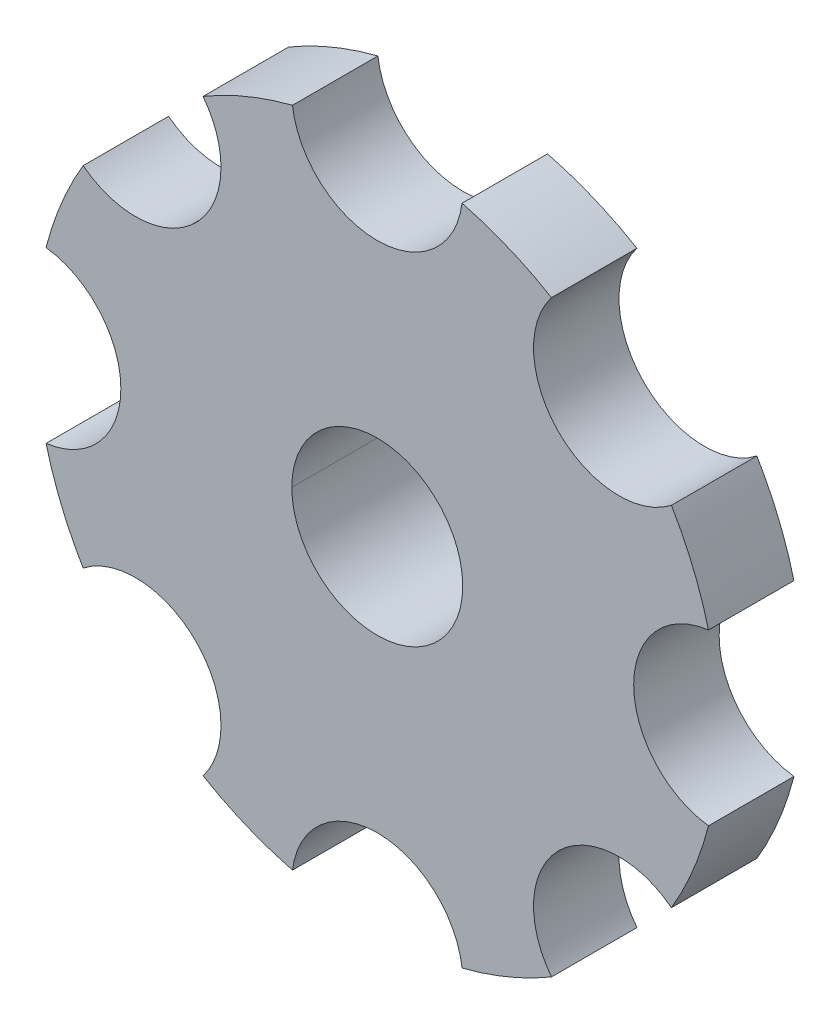
ISO-10303-21;
HEADER;
FILE_DESCRIPTION(('STEP AP214'),'2;1');
FILE_NAME('part.step','',(''),(''),'','','');
FILE_SCHEMA(('AUTOMOTIVE_DESIGN { 1 0 10303 214 1 1 1 1 }'));
ENDSEC;
DATA;
#1=APPLICATION_CONTEXT('core data for automotive mechanical design processes');
#2=APPLICATION_PROTOCOL_DEFINITION('international standard','automotive_design',2000,#1);
#3=PRODUCT_CONTEXT('',#1,'mechanical');
#4=PRODUCT('Part','Part','',(#3));
#5=PRODUCT_RELATED_PRODUCT_CATEGORY('part','',(#4));
#6=PRODUCT_DEFINITION_FORMATION('','',#4);
#7=PRODUCT_DEFINITION_CONTEXT('part definition',#1,'design');
#8=PRODUCT_DEFINITION('design','',#6,#7);
#9=PRODUCT_DEFINITION_SHAPE('','',#8);
#10=(LENGTH_UNIT() NAMED_UNIT(*) SI_UNIT(.MILLI.,.METRE.));
#11=(NAMED_UNIT(*) PLANE_ANGLE_UNIT() SI_UNIT($,.RADIAN.));
#12=(NAMED_UNIT(*) SI_UNIT($,.STERADIAN.) SOLID_ANGLE_UNIT());
#13=UNCERTAINTY_MEASURE_WITH_UNIT(LENGTH_MEASURE(1.E-05),#10,'distance_accuracy_value','');
#14=(GEOMETRIC_REPRESENTATION_CONTEXT(3) GLOBAL_UNCERTAINTY_ASSIGNED_CONTEXT((#13)) GLOBAL_UNIT_ASSIGNED_CONTEXT((#10,
#11,#12)) REPRESENTATION_CONTEXT('',''));
#15=CARTESIAN_POINT('',(0.,0.,0.));
#16=DIRECTION('',(0.,0.,1.));
#17=DIRECTION('',(1.,0.,0.));
#18=AXIS2_PLACEMENT_3D('',#15,#16,#17);
#19=CARTESIAN_POINT('',(0.,0.,0.4));
#20=DIRECTION('',(0.,0.,1.));
#21=DIRECTION('',(1.,0.,0.));
#22=AXIS2_PLACEMENT_3D('',#19,#20,#21);
#23=TOROIDAL_SURFACE('',#22,0.85,0.1);
#24=CARTESIAN_POINT('',(-0.85,0.,0.4));
#25=DIRECTION('',(0.,1.,0.));
#26=DIRECTION('',(-1.,0.,0.));
#27=AXIS2_PLACEMENT_3D('',#24,#25,#26);
#28=CIRCLE('',#27,0.1);
#29=CARTESIAN_POINT('',(-0.85,0.,0.5));
#30=VERTEX_POINT('',#29);
#31=CARTESIAN_POINT('',(-0.75,0.,0.4));
#32=VERTEX_POINT('',#31);
#33=EDGE_CURVE('E346',#30,#32,#28,.T.);
#34=ORIENTED_EDGE('',*,*,#33,.F.);
#35=CARTESIAN_POINT('',(0.,0.,0.5));
#36=DIRECTION('',(0.,0.,1.));
#37=DIRECTION('',(1.,0.,0.));
#38=AXIS2_PLACEMENT_3D('',#35,#36,#37);
#39=CIRCLE('',#38,0.85);
#40=CARTESIAN_POINT('',(0.85,0.,0.5));
#41=VERTEX_POINT('',#40);
#42=EDGE_CURVE('E10',#41,#30,#39,.T.);
#43=ORIENTED_EDGE('',*,*,#42,.F.);
#44=CARTESIAN_POINT('',(0.85,0.,0.4));
#45=DIRECTION('',(0.,-1.,0.));
#46=DIRECTION('',(0.,0.,-1.));
#47=AXIS2_PLACEMENT_3D('',#44,#45,#46);
#48=CIRCLE('',#47,0.1);
#49=CARTESIAN_POINT('',(0.75,0.,0.4));
#50=VERTEX_POINT('',#49);
#51=EDGE_CURVE('E522',#41,#50,#48,.T.);
#52=ORIENTED_EDGE('',*,*,#51,.T.);
#53=CARTESIAN_POINT('',(0.,0.,0.4));
#54=DIRECTION('',(0.,0.,-1.));
#55=DIRECTION('',(1.,0.,0.));
#56=AXIS2_PLACEMENT_3D('',#53,#54,#55);
#57=CIRCLE('',#56,0.75);
#58=EDGE_CURVE('E373',#32,#50,#57,.T.);
#59=ORIENTED_EDGE('',*,*,#58,.F.);
#60=EDGE_LOOP('',(#34,#43,#52,#59));
#61=FACE_BOUND('',#60,.T.);
#62=ADVANCED_FACE('F16',(#61),#23,.F.);
#63=CARTESIAN_POINT('',(-2.,0.,0.));
#64=DIRECTION('',(0.,0.,1.));
#65=DIRECTION('',(1.,0.,0.));
#66=AXIS2_PLACEMENT_3D('',#63,#64,#65);
#67=CYLINDRICAL_SURFACE('',#66,0.5);
#68=DIRECTION('',(0.,0.,1.));
#69=VECTOR('',#68,1.);
#70=CARTESIAN_POINT('',(-1.5,0.,0.));
#71=LINE('',#70,#69);
#72=CARTESIAN_POINT('',(-1.5,0.,0.5));
#73=VERTEX_POINT('',#72);
#74=CARTESIAN_POINT('',(-1.5,0.,1.));
#75=VERTEX_POINT('',#74);
#76=EDGE_CURVE('E525',#73,#75,#71,.T.);
#77=ORIENTED_EDGE('',*,*,#76,.F.);
#78=CARTESIAN_POINT('',(-2.,0.,0.5));
#79=DIRECTION('',(0.,0.,1.));
#80=DIRECTION('',(1.,0.,0.));
#81=AXIS2_PLACEMENT_3D('',#78,#79,#80);
#82=CIRCLE('',#81,0.5);
#83=CARTESIAN_POINT('',(-1.9375,-0.496078370824618,0.5));
#84=VERTEX_POINT('',#83);
#85=EDGE_CURVE('E309',#84,#73,#82,.T.);
#86=ORIENTED_EDGE('',*,*,#85,.F.);
#87=DIRECTION('',(0.,0.,-1.));
#88=VECTOR('',#87,1.);
#89=CARTESIAN_POINT('',(-1.9375,-0.496078370824618,0.5));
#90=LINE('',#89,#88);
#91=CARTESIAN_POINT('',(-1.9375,-0.496078370824618,1.));
#92=VERTEX_POINT('',#91);
#93=EDGE_CURVE('E408',#92,#84,#90,.T.);
#94=ORIENTED_EDGE('',*,*,#93,.F.);
#95=CARTESIAN_POINT('',(-2.,0.,1.));
#96=DIRECTION('',(0.,0.,1.));
#97=DIRECTION('',(0.,1.,0.));
#98=AXIS2_PLACEMENT_3D('',#95,#96,#97);
#99=CIRCLE('',#98,0.5);
#100=EDGE_CURVE('E323',#92,#75,#99,.T.);
#101=ORIENTED_EDGE('',*,*,#100,.T.);
#102=EDGE_LOOP('',(#77,#86,#94,#101));
#103=FACE_BOUND('',#102,.T.);
#104=ADVANCED_FACE('F922',(#103),#67,.F.);
#105=CARTESIAN_POINT('',(-1.41421356237309,-1.4142135623731,0.));
#106=DIRECTION('',(0.,0.,1.));
#107=DIRECTION('',(1.,0.,0.));
#108=AXIS2_PLACEMENT_3D('',#105,#106,#107);
#109=CYLINDRICAL_SURFACE('',#108,0.5);
#110=DIRECTION('',(0.,0.,1.));
#111=VECTOR('',#110,1.);
#112=CARTESIAN_POINT('',(-0.914213562373088,-1.4142135623731,0.));
#113=LINE('',#112,#111);
#114=CARTESIAN_POINT('',(-0.914213562373088,-1.4142135623731,0.5));
#115=VERTEX_POINT('',#114);
#116=CARTESIAN_POINT('',(-0.914213562373088,-1.4142135623731,1.));
#117=VERTEX_POINT('',#116);
#118=EDGE_CURVE('E532',#115,#117,#113,.T.);
#119=ORIENTED_EDGE('',*,*,#118,.F.);
#120=CARTESIAN_POINT('',(-1.41421356237309,-1.4142135623731,0.5));
#121=DIRECTION('',(0.,0.,1.));
#122=DIRECTION('',(1.,0.,0.));
#123=AXIS2_PLACEMENT_3D('',#120,#121,#122);
#124=CIRCLE('',#123,0.5);
#125=CARTESIAN_POINT('',(-1.01923900853887,-1.720799768559,0.5));
#126=VERTEX_POINT('',#125);
#127=EDGE_CURVE('E27',#126,#115,#124,.T.);
#128=ORIENTED_EDGE('',*,*,#127,.F.);
#129=DIRECTION('',(0.,0.,-1.));
#130=VECTOR('',#129,1.);
#131=CARTESIAN_POINT('',(-1.01923900853887,-1.720799768559,0.5));
#132=LINE('',#131,#130);
#133=CARTESIAN_POINT('',(-1.01923900853887,-1.720799768559,1.));
#134=VERTEX_POINT('',#133);
#135=EDGE_CURVE('E334',#134,#126,#132,.T.);
#136=ORIENTED_EDGE('',*,*,#135,.F.);
#137=CARTESIAN_POINT('',(-1.41421356237309,-1.4142135623731,1.));
#138=DIRECTION('',(0.,0.,1.));
#139=DIRECTION('',(-0.707106781186551,0.707106781186544,0.));
#140=AXIS2_PLACEMENT_3D('',#137,#138,#139);
#141=CIRCLE('',#140,0.5);
#142=EDGE_CURVE('E209',#134,#117,#141,.T.);
#143=ORIENTED_EDGE('',*,*,#142,.T.);
#144=EDGE_LOOP('',(#119,#128,#136,#143));
#145=FACE_BOUND('',#144,.T.);
#146=ADVANCED_FACE('F926',(#145),#109,.F.);
#147=CARTESIAN_POINT('',(0.,-2.,0.));
#148=DIRECTION('',(0.,0.,1.));
#149=DIRECTION('',(1.,0.,0.));
#150=AXIS2_PLACEMENT_3D('',#147,#148,#149);
#151=CYLINDRICAL_SURFACE('',#150,0.5);
#152=CARTESIAN_POINT('',(0.,-2.,0.5));
#153=DIRECTION('',(0.,0.,1.));
#154=DIRECTION('',(1.,0.,0.));
#155=AXIS2_PLACEMENT_3D('',#152,#153,#154);
#156=CIRCLE('',#155,0.5);
#157=CARTESIAN_POINT('',(0.496078370824611,-1.9375,0.5));
#158=VERTEX_POINT('',#157);
#159=CARTESIAN_POINT('',(-0.496078370824611,-1.9375,0.5));
#160=VERTEX_POINT('',#159);
#161=EDGE_CURVE('E405',#158,#160,#156,.T.);
#162=ORIENTED_EDGE('',*,*,#161,.F.);
#163=DIRECTION('',(0.,0.,-1.));
#164=VECTOR('',#163,1.);
#165=CARTESIAN_POINT('',(0.496078370824611,-1.9375,0.5));
#166=LINE('',#165,#164);
#167=CARTESIAN_POINT('',(0.496078370824611,-1.9375,1.));
#168=VERTEX_POINT('',#167);
#169=EDGE_CURVE('E20',#168,#158,#166,.T.);
#170=ORIENTED_EDGE('',*,*,#169,.F.);
#171=CARTESIAN_POINT('',(0.,-2.,1.));
#172=DIRECTION('',(0.,0.,1.));
#173=DIRECTION('',(-1.,0.,0.));
#174=AXIS2_PLACEMENT_3D('',#171,#172,#173);
#175=CIRCLE('',#174,0.5);
#176=CARTESIAN_POINT('',(-0.496078370824611,-1.9375,1.));
#177=VERTEX_POINT('',#176);
#178=EDGE_CURVE('E322',#168,#177,#175,.T.);
#179=ORIENTED_EDGE('',*,*,#178,.T.);
#180=DIRECTION('',(0.,0.,1.));
#181=VECTOR('',#180,1.);
#182=CARTESIAN_POINT('',(-0.496078370824611,-1.9375,0.5));
#183=LINE('',#182,#181);
#184=EDGE_CURVE('E436',#160,#177,#183,.T.);
#185=ORIENTED_EDGE('',*,*,#184,.F.);
#186=EDGE_LOOP('',(#162,#170,#179,#185));
#187=FACE_BOUND('',#186,.T.);
#188=ADVANCED_FACE('F969',(#187),#151,.F.);
#189=CARTESIAN_POINT('',(1.41421356237311,-1.41421356237308,0.));
#190=DIRECTION('',(0.,0.,1.));
#191=DIRECTION('',(1.,0.,0.));
#192=AXIS2_PLACEMENT_3D('',#189,#190,#191);
#193=CYLINDRICAL_SURFACE('',#192,0.5);
#194=CARTESIAN_POINT('',(1.41421356237311,-1.41421356237308,0.5));
#195=DIRECTION('',(0.,0.,1.));
#196=DIRECTION('',(1.,0.,0.));
#197=AXIS2_PLACEMENT_3D('',#194,#195,#196);
#198=CIRCLE('',#197,0.5);
#199=CARTESIAN_POINT('',(1.720799768559,-1.01923900853886,0.5));
#200=VERTEX_POINT('',#199);
#201=CARTESIAN_POINT('',(1.01923900853889,-1.72079976855898,0.5));
#202=VERTEX_POINT('',#201);
#203=EDGE_CURVE('E254',#200,#202,#198,.T.);
#204=ORIENTED_EDGE('',*,*,#203,.F.);
#205=DIRECTION('',(0.,0.,-1.));
#206=VECTOR('',#205,1.);
#207=CARTESIAN_POINT('',(1.720799768559,-1.01923900853886,0.5));
#208=LINE('',#207,#206);
#209=CARTESIAN_POINT('',(1.720799768559,-1.01923900853886,1.));
#210=VERTEX_POINT('',#209);
#211=EDGE_CURVE('E269',#210,#200,#208,.T.);
#212=ORIENTED_EDGE('',*,*,#211,.F.);
#213=CARTESIAN_POINT('',(1.41421356237311,-1.41421356237308,1.));
#214=DIRECTION('',(0.,0.,1.));
#215=DIRECTION('',(-0.707106781186542,-0.707106781186554,0.));
#216=AXIS2_PLACEMENT_3D('',#213,#214,#215);
#217=CIRCLE('',#216,0.5);
#218=CARTESIAN_POINT('',(1.01923900853889,-1.72079976855898,1.));
#219=VERTEX_POINT('',#218);
#220=EDGE_CURVE('E400',#210,#219,#217,.T.);
#221=ORIENTED_EDGE('',*,*,#220,.T.);
#222=DIRECTION('',(0.,0.,1.));
#223=VECTOR('',#222,1.);
#224=CARTESIAN_POINT('',(1.01923900853889,-1.72079976855898,0.5));
#225=LINE('',#224,#223);
#226=EDGE_CURVE('E310',#202,#219,#225,.T.);
#227=ORIENTED_EDGE('',*,*,#226,.F.);
#228=EDGE_LOOP('',(#204,#212,#221,#227));
#229=FACE_BOUND('',#228,.T.);
#230=ADVANCED_FACE('F467',(#229),#193,.F.);
#231=CARTESIAN_POINT('',(2.,0.,0.));
#232=DIRECTION('',(0.,0.,1.));
#233=DIRECTION('',(1.,0.,0.));
#234=AXIS2_PLACEMENT_3D('',#231,#232,#233);
#235=CYLINDRICAL_SURFACE('',#234,0.5);
#236=CARTESIAN_POINT('',(2.,0.,0.5));
#237=DIRECTION('',(0.,0.,1.));
#238=DIRECTION('',(1.,0.,0.));
#239=AXIS2_PLACEMENT_3D('',#236,#237,#238);
#240=CIRCLE('',#239,0.5);
#241=CARTESIAN_POINT('',(1.9375,0.496078370824631,0.5));
#242=VERTEX_POINT('',#241);
#243=CARTESIAN_POINT('',(1.9375,-0.496078370824591,0.5));
#244=VERTEX_POINT('',#243);
#245=EDGE_CURVE('E242',#242,#244,#240,.T.);
#246=ORIENTED_EDGE('',*,*,#245,.F.);
#247=DIRECTION('',(0.,0.,-1.));
#248=VECTOR('',#247,1.);
#249=CARTESIAN_POINT('',(1.9375,0.496078370824631,0.5));
#250=LINE('',#249,#248);
#251=CARTESIAN_POINT('',(1.9375,0.496078370824631,1.));
#252=VERTEX_POINT('',#251);
#253=EDGE_CURVE('E294',#252,#242,#250,.T.);
#254=ORIENTED_EDGE('',*,*,#253,.F.);
#255=CARTESIAN_POINT('',(2.,0.,1.));
#256=DIRECTION('',(0.,0.,1.));
#257=DIRECTION('',(0.,-1.,0.));
#258=AXIS2_PLACEMENT_3D('',#255,#256,#257);
#259=CIRCLE('',#258,0.5);
#260=CARTESIAN_POINT('',(1.9375,-0.496078370824591,1.));
#261=VERTEX_POINT('',#260);
#262=EDGE_CURVE('E260',#252,#261,#259,.T.);
#263=ORIENTED_EDGE('',*,*,#262,.T.);
#264=DIRECTION('',(0.,0.,1.));
#265=VECTOR('',#264,1.);
#266=CARTESIAN_POINT('',(1.9375,-0.496078370824591,0.5));
#267=LINE('',#266,#265);
#268=EDGE_CURVE('E258',#244,#261,#267,.T.);
#269=ORIENTED_EDGE('',*,*,#268,.F.);
#270=EDGE_LOOP('',(#246,#254,#263,#269));
#271=FACE_BOUND('',#270,.T.);
#272=ADVANCED_FACE('F259',(#271),#235,.F.);
#273=CARTESIAN_POINT('',(1.41421356237308,1.41421356237311,0.));
#274=DIRECTION('',(0.,0.,1.));
#275=DIRECTION('',(1.,0.,0.));
#276=AXIS2_PLACEMENT_3D('',#273,#274,#275);
#277=CYLINDRICAL_SURFACE('',#276,0.5);
#278=CARTESIAN_POINT('',(1.41421356237308,1.41421356237311,0.5));
#279=DIRECTION('',(0.,0.,1.));
#280=DIRECTION('',(1.,0.,0.));
#281=AXIS2_PLACEMENT_3D('',#278,#279,#280);
#282=CIRCLE('',#281,0.5);
#283=CARTESIAN_POINT('',(1.01923900853886,1.72079976855901,0.5));
#284=VERTEX_POINT('',#283);
#285=CARTESIAN_POINT('',(1.72079976855898,1.0192390085389,0.5));
#286=VERTEX_POINT('',#285);
#287=EDGE_CURVE('E255',#284,#286,#282,.T.);
#288=ORIENTED_EDGE('',*,*,#287,.F.);
#289=DIRECTION('',(0.,0.,-1.));
#290=VECTOR('',#289,1.);
#291=CARTESIAN_POINT('',(1.01923900853886,1.72079976855901,0.5));
#292=LINE('',#291,#290);
#293=CARTESIAN_POINT('',(1.01923900853886,1.72079976855901,1.));
#294=VERTEX_POINT('',#293);
#295=EDGE_CURVE('E286',#294,#284,#292,.T.);
#296=ORIENTED_EDGE('',*,*,#295,.F.);
#297=CARTESIAN_POINT('',(1.41421356237308,1.41421356237311,1.));
#298=DIRECTION('',(0.,0.,1.));
#299=DIRECTION('',(0.707106781186556,-0.707106781186539,0.));
#300=AXIS2_PLACEMENT_3D('',#297,#298,#299);
#301=CIRCLE('',#300,0.5);
#302=CARTESIAN_POINT('',(1.72079976855898,1.0192390085389,1.));
#303=VERTEX_POINT('',#302);
#304=EDGE_CURVE('E337',#294,#303,#301,.T.);
#305=ORIENTED_EDGE('',*,*,#304,.T.);
#306=DIRECTION('',(0.,0.,1.));
#307=VECTOR('',#306,1.);
#308=CARTESIAN_POINT('',(1.72079976855898,1.0192390085389,0.5));
#309=LINE('',#308,#307);
#310=EDGE_CURVE('E293',#286,#303,#309,.T.);
#311=ORIENTED_EDGE('',*,*,#310,.F.);
#312=EDGE_LOOP('',(#288,#296,#305,#311));
#313=FACE_BOUND('',#312,.T.);
#314=ADVANCED_FACE('F868',(#313),#277,.F.);
#315=CARTESIAN_POINT('',(-1.4142135623731,1.41421356237309,0.));
#316=DIRECTION('',(0.,0.,1.));
#317=DIRECTION('',(1.,0.,0.));
#318=AXIS2_PLACEMENT_3D('',#315,#316,#317);
#319=CYLINDRICAL_SURFACE('',#318,0.5);
#320=DIRECTION('',(0.,0.,1.));
#321=VECTOR('',#320,1.);
#322=CARTESIAN_POINT('',(-0.914213562373098,1.41421356237309,0.));
#323=LINE('',#322,#321);
#324=CARTESIAN_POINT('',(-0.914213562373098,1.41421356237309,0.5));
#325=VERTEX_POINT('',#324);
#326=CARTESIAN_POINT('',(-0.914213562373098,1.41421356237309,1.));
#327=VERTEX_POINT('',#326);
#328=EDGE_CURVE('E295',#325,#327,#323,.T.);
#329=ORIENTED_EDGE('',*,*,#328,.F.);
#330=CARTESIAN_POINT('',(-1.4142135623731,1.41421356237309,0.5));
#331=DIRECTION('',(0.,0.,1.));
#332=DIRECTION('',(1.,0.,0.));
#333=AXIS2_PLACEMENT_3D('',#330,#331,#332);
#334=CIRCLE('',#333,0.5);
#335=CARTESIAN_POINT('',(-1.72079976855899,1.01923900853888,0.5));
#336=VERTEX_POINT('',#335);
#337=EDGE_CURVE('E290',#336,#325,#334,.T.);
#338=ORIENTED_EDGE('',*,*,#337,.F.);
#339=DIRECTION('',(0.,0.,-1.));
#340=VECTOR('',#339,1.);
#341=CARTESIAN_POINT('',(-1.72079976855899,1.01923900853888,0.5));
#342=LINE('',#341,#340);
#343=CARTESIAN_POINT('',(-1.72079976855899,1.01923900853888,1.));
#344=VERTEX_POINT('',#343);
#345=EDGE_CURVE('E367',#344,#336,#342,.T.);
#346=ORIENTED_EDGE('',*,*,#345,.F.);
#347=CARTESIAN_POINT('',(-1.4142135623731,1.41421356237309,1.));
#348=DIRECTION('',(0.,0.,1.));
#349=DIRECTION('',(0.707106781186546,0.707106781186549,0.));
#350=AXIS2_PLACEMENT_3D('',#347,#348,#349);
#351=CIRCLE('',#350,0.5);
#352=EDGE_CURVE('E324',#344,#327,#351,.T.);
#353=ORIENTED_EDGE('',*,*,#352,.T.);
#354=EDGE_LOOP('',(#329,#338,#346,#353));
#355=FACE_BOUND('',#354,.T.);
#356=ADVANCED_FACE('F888',(#355),#319,.F.);
#357=CARTESIAN_POINT('',(0.,2.,0.));
#358=DIRECTION('',(0.,0.,1.));
#359=DIRECTION('',(1.,0.,0.));
#360=AXIS2_PLACEMENT_3D('',#357,#358,#359);
#361=CYLINDRICAL_SURFACE('',#360,0.5);
#362=CARTESIAN_POINT('',(0.,2.,0.5));
#363=DIRECTION('',(0.,0.,1.));
#364=DIRECTION('',(1.,0.,0.));
#365=AXIS2_PLACEMENT_3D('',#362,#363,#364);
#366=CIRCLE('',#365,0.5);
#367=CARTESIAN_POINT('',(-0.496078370824611,1.9375,0.5));
#368=VERTEX_POINT('',#367);
#369=CARTESIAN_POINT('',(0.496078370824611,1.9375,0.5));
#370=VERTEX_POINT('',#369);
#371=EDGE_CURVE('E42',#368,#370,#366,.T.);
#372=ORIENTED_EDGE('',*,*,#371,.F.);
#373=DIRECTION('',(0.,0.,-1.));
#374=VECTOR('',#373,1.);
#375=CARTESIAN_POINT('',(-0.496078370824611,1.9375,0.5));
#376=LINE('',#375,#374);
#377=CARTESIAN_POINT('',(-0.496078370824611,1.9375,1.));
#378=VERTEX_POINT('',#377);
#379=EDGE_CURVE('E318',#378,#368,#376,.T.);
#380=ORIENTED_EDGE('',*,*,#379,.F.);
#381=CARTESIAN_POINT('',(0.,2.,1.));
#382=DIRECTION('',(0.,0.,1.));
#383=DIRECTION('',(1.,0.,0.));
#384=AXIS2_PLACEMENT_3D('',#381,#382,#383);
#385=CIRCLE('',#384,0.5);
#386=CARTESIAN_POINT('',(0.496078370824611,1.9375,1.));
#387=VERTEX_POINT('',#386);
#388=EDGE_CURVE('E327',#378,#387,#385,.T.);
#389=ORIENTED_EDGE('',*,*,#388,.T.);
#390=DIRECTION('',(0.,0.,1.));
#391=VECTOR('',#390,1.);
#392=CARTESIAN_POINT('',(0.496078370824611,1.9375,0.5));
#393=LINE('',#392,#391);
#394=EDGE_CURVE('E369',#370,#387,#393,.T.);
#395=ORIENTED_EDGE('',*,*,#394,.F.);
#396=EDGE_LOOP('',(#372,#380,#389,#395));
#397=FACE_BOUND('',#396,.T.);
#398=ADVANCED_FACE('F892',(#397),#361,.F.);
#399=CARTESIAN_POINT('',(0.,0.,0.5));
#400=DIRECTION('',(0.,0.,1.));
#401=DIRECTION('',(1.,0.,0.));
#402=AXIS2_PLACEMENT_3D('',#399,#400,#401);
#403=PLANE('',#402);
#404=ORIENTED_EDGE('',*,*,#42,.T.);
#405=CARTESIAN_POINT('',(0.,0.,0.5));
#406=DIRECTION('',(0.,0.,1.));
#407=DIRECTION('',(1.,0.,0.));
#408=AXIS2_PLACEMENT_3D('',#405,#406,#407);
#409=CIRCLE('',#408,0.85);
#410=EDGE_CURVE('E342',#30,#41,#409,.T.);
#411=ORIENTED_EDGE('',*,*,#410,.T.);
#412=EDGE_LOOP('',(#404,#411));
#413=FACE_BOUND('',#412,.T.);
#414=CARTESIAN_POINT('',(0.,0.,0.5));
#415=DIRECTION('',(0.,0.,1.));
#416=DIRECTION('',(1.,0.,0.));
#417=AXIS2_PLACEMENT_3D('',#414,#415,#416);
#418=CIRCLE('',#417,2.);
#419=CARTESIAN_POINT('',(-1.72079976855899,-1.01923900853889,0.5));
#420=VERTEX_POINT('',#419);
#421=EDGE_CURVE('E198',#84,#420,#418,.T.);
#422=ORIENTED_EDGE('',*,*,#421,.F.);
#423=ORIENTED_EDGE('',*,*,#85,.T.);
#424=CARTESIAN_POINT('',(-2.,0.,0.5));
#425=DIRECTION('',(0.,0.,1.));
#426=DIRECTION('',(1.,0.,0.));
#427=AXIS2_PLACEMENT_3D('',#424,#425,#426);
#428=CIRCLE('',#427,0.5);
#429=CARTESIAN_POINT('',(-1.9375,0.496078370824604,0.5));
#430=VERTEX_POINT('',#429);
#431=EDGE_CURVE('E280',#73,#430,#428,.T.);
#432=ORIENTED_EDGE('',*,*,#431,.T.);
#433=CARTESIAN_POINT('',(0.,0.,0.5));
#434=DIRECTION('',(0.,0.,1.));
#435=DIRECTION('',(1.,0.,0.));
#436=AXIS2_PLACEMENT_3D('',#433,#434,#435);
#437=CIRCLE('',#436,2.);
#438=EDGE_CURVE('E368',#336,#430,#437,.T.);
#439=ORIENTED_EDGE('',*,*,#438,.F.);
#440=ORIENTED_EDGE('',*,*,#337,.T.);
#441=CARTESIAN_POINT('',(-1.4142135623731,1.41421356237309,0.5));
#442=DIRECTION('',(0.,0.,1.));
#443=DIRECTION('',(1.,0.,0.));
#444=AXIS2_PLACEMENT_3D('',#441,#442,#443);
#445=CIRCLE('',#444,0.5);
#446=CARTESIAN_POINT('',(-1.01923900853888,1.72079976855899,0.5));
#447=VERTEX_POINT('',#446);
#448=EDGE_CURVE('E300',#325,#447,#445,.T.);
#449=ORIENTED_EDGE('',*,*,#448,.T.);
#450=CARTESIAN_POINT('',(0.,0.,0.5));
#451=DIRECTION('',(0.,0.,1.));
#452=DIRECTION('',(1.,0.,0.));
#453=AXIS2_PLACEMENT_3D('',#450,#451,#452);
#454=CIRCLE('',#453,2.);
#455=EDGE_CURVE('E319',#368,#447,#454,.T.);
#456=ORIENTED_EDGE('',*,*,#455,.F.);
#457=ORIENTED_EDGE('',*,*,#371,.T.);
#458=CARTESIAN_POINT('',(0.,0.,0.5));
#459=DIRECTION('',(0.,0.,1.));
#460=DIRECTION('',(1.,0.,0.));
#461=AXIS2_PLACEMENT_3D('',#458,#459,#460);
#462=CIRCLE('',#461,2.);
#463=EDGE_CURVE('E372',#284,#370,#462,.T.);
#464=ORIENTED_EDGE('',*,*,#463,.F.);
#465=ORIENTED_EDGE('',*,*,#287,.T.);
#466=CARTESIAN_POINT('',(0.,0.,0.5));
#467=DIRECTION('',(0.,0.,1.));
#468=DIRECTION('',(1.,0.,0.));
#469=AXIS2_PLACEMENT_3D('',#466,#467,#468);
#470=CIRCLE('',#469,2.);
#471=EDGE_CURVE('E249',#242,#286,#470,.T.);
#472=ORIENTED_EDGE('',*,*,#471,.F.);
#473=ORIENTED_EDGE('',*,*,#245,.T.);
#474=CARTESIAN_POINT('',(0.,0.,0.5));
#475=DIRECTION('',(0.,0.,1.));
#476=DIRECTION('',(1.,0.,0.));
#477=AXIS2_PLACEMENT_3D('',#474,#475,#476);
#478=CIRCLE('',#477,2.);
#479=EDGE_CURVE('E246',#200,#244,#478,.T.);
#480=ORIENTED_EDGE('',*,*,#479,.F.);
#481=ORIENTED_EDGE('',*,*,#203,.T.);
#482=CARTESIAN_POINT('',(0.,0.,0.5));
#483=DIRECTION('',(0.,0.,1.));
#484=DIRECTION('',(1.,0.,0.));
#485=AXIS2_PLACEMENT_3D('',#482,#483,#484);
#486=CIRCLE('',#485,2.);
#487=EDGE_CURVE('E314',#158,#202,#486,.T.);
#488=ORIENTED_EDGE('',*,*,#487,.F.);
#489=ORIENTED_EDGE('',*,*,#161,.T.);
#490=CARTESIAN_POINT('',(0.,0.,0.5));
#491=DIRECTION('',(0.,0.,1.));
#492=DIRECTION('',(1.,0.,0.));
#493=AXIS2_PLACEMENT_3D('',#490,#491,#492);
#494=CIRCLE('',#493,2.);
#495=EDGE_CURVE('E429',#126,#160,#494,.T.);
#496=ORIENTED_EDGE('',*,*,#495,.F.);
#497=ORIENTED_EDGE('',*,*,#127,.T.);
#498=CARTESIAN_POINT('',(-1.41421356237309,-1.4142135623731,0.5));
#499=DIRECTION('',(0.,0.,1.));
#500=DIRECTION('',(1.,0.,0.));
#501=AXIS2_PLACEMENT_3D('',#498,#499,#500);
#502=CIRCLE('',#501,0.5);
#503=EDGE_CURVE('E305',#115,#420,#502,.T.);
#504=ORIENTED_EDGE('',*,*,#503,.T.);
#505=EDGE_LOOP('',(#422,#423,#432,#439,#440,#449,#456,#457,#464,#465,#472,#473,#480,#481,#488,
#489,#496,#497,#504));
#506=FACE_BOUND('',#505,.T.);
#507=ADVANCED_FACE('F244',(#413,#506),#403,.F.);
#508=CARTESIAN_POINT('',(0.,0.,1.));
#509=DIRECTION('',(0.,0.,1.));
#510=DIRECTION('',(1.,0.,0.));
#511=AXIS2_PLACEMENT_3D('',#508,#509,#510);
#512=PLANE('',#511);
#513=CARTESIAN_POINT('',(0.,0.,1.));
#514=DIRECTION('',(0.,0.,-1.));
#515=DIRECTION('',(-1.,0.,0.));
#516=AXIS2_PLACEMENT_3D('',#513,#514,#515);
#517=CIRCLE('',#516,0.5);
#518=CARTESIAN_POINT('',(-0.5,0.,1.));
#519=VERTEX_POINT('',#518);
#520=CARTESIAN_POINT('',(0.5,0.,1.));
#521=VERTEX_POINT('',#520);
#522=EDGE_CURVE('E287',#519,#521,#517,.T.);
#523=ORIENTED_EDGE('',*,*,#522,.T.);
#524=CARTESIAN_POINT('',(0.,0.,1.));
#525=DIRECTION('',(0.,0.,-1.));
#526=DIRECTION('',(-1.,0.,0.));
#527=AXIS2_PLACEMENT_3D('',#524,#525,#526);
#528=CIRCLE('',#527,0.5);
#529=EDGE_CURVE('E357',#521,#519,#528,.T.);
#530=ORIENTED_EDGE('',*,*,#529,.T.);
#531=EDGE_LOOP('',(#523,#530));
#532=FACE_BOUND('',#531,.T.);
#533=ORIENTED_EDGE('',*,*,#100,.F.);
#534=CARTESIAN_POINT('',(0.,0.,1.));
#535=DIRECTION('',(0.,0.,1.));
#536=DIRECTION('',(1.,0.,0.));
#537=AXIS2_PLACEMENT_3D('',#534,#535,#536);
#538=CIRCLE('',#537,2.);
#539=CARTESIAN_POINT('',(-1.72079976855899,-1.01923900853889,1.));
#540=VERTEX_POINT('',#539);
#541=EDGE_CURVE('E406',#92,#540,#538,.T.);
#542=ORIENTED_EDGE('',*,*,#541,.T.);
#543=CARTESIAN_POINT('',(-1.41421356237309,-1.4142135623731,1.));
#544=DIRECTION('',(0.,0.,1.));
#545=DIRECTION('',(-0.707106781186551,0.707106781186544,0.));
#546=AXIS2_PLACEMENT_3D('',#543,#544,#545);
#547=CIRCLE('',#546,0.5);
#548=EDGE_CURVE('E447',#117,#540,#547,.T.);
#549=ORIENTED_EDGE('',*,*,#548,.F.);
#550=ORIENTED_EDGE('',*,*,#142,.F.);
#551=CARTESIAN_POINT('',(0.,0.,1.));
#552=DIRECTION('',(0.,0.,1.));
#553=DIRECTION('',(1.,0.,0.));
#554=AXIS2_PLACEMENT_3D('',#551,#552,#553);
#555=CIRCLE('',#554,2.);
#556=EDGE_CURVE('E330',#134,#177,#555,.T.);
#557=ORIENTED_EDGE('',*,*,#556,.T.);
#558=ORIENTED_EDGE('',*,*,#178,.F.);
#559=CARTESIAN_POINT('',(0.,0.,1.));
#560=DIRECTION('',(0.,0.,1.));
#561=DIRECTION('',(1.,0.,0.));
#562=AXIS2_PLACEMENT_3D('',#559,#560,#561);
#563=CIRCLE('',#562,2.);
#564=EDGE_CURVE('E443',#168,#219,#563,.T.);
#565=ORIENTED_EDGE('',*,*,#564,.T.);
#566=ORIENTED_EDGE('',*,*,#220,.F.);
#567=CARTESIAN_POINT('',(0.,0.,1.));
#568=DIRECTION('',(0.,0.,1.));
#569=DIRECTION('',(1.,0.,0.));
#570=AXIS2_PLACEMENT_3D('',#567,#568,#569);
#571=CIRCLE('',#570,2.);
#572=EDGE_CURVE('E276',#210,#261,#571,.T.);
#573=ORIENTED_EDGE('',*,*,#572,.T.);
#574=ORIENTED_EDGE('',*,*,#262,.F.);
#575=CARTESIAN_POINT('',(0.,0.,1.));
#576=DIRECTION('',(0.,0.,1.));
#577=DIRECTION('',(1.,0.,0.));
#578=AXIS2_PLACEMENT_3D('',#575,#576,#577);
#579=CIRCLE('',#578,2.);
#580=EDGE_CURVE('E265',#252,#303,#579,.T.);
#581=ORIENTED_EDGE('',*,*,#580,.T.);
#582=ORIENTED_EDGE('',*,*,#304,.F.);
#583=CARTESIAN_POINT('',(0.,0.,1.));
#584=DIRECTION('',(0.,0.,1.));
#585=DIRECTION('',(1.,0.,0.));
#586=AXIS2_PLACEMENT_3D('',#583,#584,#585);
#587=CIRCLE('',#586,2.);
#588=EDGE_CURVE('E282',#294,#387,#587,.T.);
#589=ORIENTED_EDGE('',*,*,#588,.T.);
#590=ORIENTED_EDGE('',*,*,#388,.F.);
#591=CARTESIAN_POINT('',(0.,0.,1.));
#592=DIRECTION('',(0.,0.,1.));
#593=DIRECTION('',(1.,0.,0.));
#594=AXIS2_PLACEMENT_3D('',#591,#592,#593);
#595=CIRCLE('',#594,2.);
#596=CARTESIAN_POINT('',(-1.01923900853888,1.72079976855899,1.));
#597=VERTEX_POINT('',#596);
#598=EDGE_CURVE('E315',#378,#597,#595,.T.);
#599=ORIENTED_EDGE('',*,*,#598,.T.);
#600=CARTESIAN_POINT('',(-1.4142135623731,1.41421356237309,1.));
#601=DIRECTION('',(0.,0.,1.));
#602=DIRECTION('',(0.707106781186546,0.707106781186549,0.));
#603=AXIS2_PLACEMENT_3D('',#600,#601,#602);
#604=CIRCLE('',#603,0.5);
#605=EDGE_CURVE('E299',#327,#597,#604,.T.);
#606=ORIENTED_EDGE('',*,*,#605,.F.);
#607=ORIENTED_EDGE('',*,*,#352,.F.);
#608=CARTESIAN_POINT('',(0.,0.,1.));
#609=DIRECTION('',(0.,0.,1.));
#610=DIRECTION('',(1.,0.,0.));
#611=AXIS2_PLACEMENT_3D('',#608,#609,#610);
#612=CIRCLE('',#611,2.);
#613=CARTESIAN_POINT('',(-1.9375,0.496078370824604,1.));
#614=VERTEX_POINT('',#613);
#615=EDGE_CURVE('E364',#344,#614,#612,.T.);
#616=ORIENTED_EDGE('',*,*,#615,.T.);
#617=CARTESIAN_POINT('',(-2.,0.,1.));
#618=DIRECTION('',(0.,0.,1.));
#619=DIRECTION('',(0.,1.,0.));
#620=AXIS2_PLACEMENT_3D('',#617,#618,#619);
#621=CIRCLE('',#620,0.5);
#622=EDGE_CURVE('E306',#75,#614,#621,.T.);
#623=ORIENTED_EDGE('',*,*,#622,.F.);
#624=EDGE_LOOP('',(#533,#542,#549,#550,#557,#558,#565,#566,#573,#574,#581,#582,#589,#590,#599,
#606,#607,#616,#623));
#625=FACE_BOUND('',#624,.T.);
#626=ADVANCED_FACE('F460',(#532,#625),#512,.T.);
#627=CARTESIAN_POINT('',(0.,0.,1.));
#628=DIRECTION('',(0.,0.,-1.));
#629=DIRECTION('',(-1.,0.,0.));
#630=AXIS2_PLACEMENT_3D('',#627,#628,#629);
#631=CYLINDRICAL_SURFACE('',#630,2.);
#632=ORIENTED_EDGE('',*,*,#588,.F.);
#633=ORIENTED_EDGE('',*,*,#295,.T.);
#634=ORIENTED_EDGE('',*,*,#463,.T.);
#635=ORIENTED_EDGE('',*,*,#394,.T.);
#636=EDGE_LOOP('',(#632,#633,#634,#635));
#637=FACE_BOUND('',#636,.T.);
#638=ADVANCED_FACE('F1086',(#637),#631,.T.);
#639=CARTESIAN_POINT('',(0.,0.,0.5));
#640=DIRECTION('',(0.,0.,-1.));
#641=DIRECTION('',(-1.,0.,0.));
#642=AXIS2_PLACEMENT_3D('',#639,#640,#641);
#643=CYLINDRICAL_SURFACE('',#642,0.5);
#644=DIRECTION('',(0.,0.,-1.));
#645=VECTOR('',#644,1.);
#646=CARTESIAN_POINT('',(0.5,0.,0.5));
#647=LINE('',#646,#645);
#648=CARTESIAN_POINT('',(0.5,0.,0.));
#649=VERTEX_POINT('',#648);
#650=EDGE_CURVE('E397',#521,#649,#647,.T.);
#651=ORIENTED_EDGE('',*,*,#650,.F.);
#652=ORIENTED_EDGE('',*,*,#522,.F.);
#653=DIRECTION('',(0.,0.,-1.));
#654=VECTOR('',#653,1.);
#655=CARTESIAN_POINT('',(-0.5,0.,0.5));
#656=LINE('',#655,#654);
#657=CARTESIAN_POINT('',(-0.5,0.,0.));
#658=VERTEX_POINT('',#657);
#659=EDGE_CURVE('E376',#519,#658,#656,.T.);
#660=ORIENTED_EDGE('',*,*,#659,.T.);
#661=CARTESIAN_POINT('',(0.,0.,0.));
#662=DIRECTION('',(0.,0.,1.));
#663=DIRECTION('',(1.,0.,0.));
#664=AXIS2_PLACEMENT_3D('',#661,#662,#663);
#665=CIRCLE('',#664,0.5);
#666=EDGE_CURVE('E338',#649,#658,#665,.T.);
#667=ORIENTED_EDGE('',*,*,#666,.F.);
#668=EDGE_LOOP('',(#651,#652,#660,#667));
#669=FACE_BOUND('',#668,.T.);
#670=ADVANCED_FACE('F880',(#669),#643,.F.);
#671=CARTESIAN_POINT('',(0.,0.,0.5));
#672=DIRECTION('',(0.,0.,-1.));
#673=DIRECTION('',(-1.,0.,0.));
#674=AXIS2_PLACEMENT_3D('',#671,#672,#673);
#675=CYLINDRICAL_SURFACE('',#674,0.75);
#676=DIRECTION('',(0.,0.,-1.));
#677=VECTOR('',#676,1.);
#678=CARTESIAN_POINT('',(0.75,0.,0.5));
#679=LINE('',#678,#677);
#680=CARTESIAN_POINT('',(0.75,0.,0.));
#681=VERTEX_POINT('',#680);
#682=EDGE_CURVE('E352',#50,#681,#679,.T.);
#683=ORIENTED_EDGE('',*,*,#682,.F.);
#684=CARTESIAN_POINT('',(0.,0.,0.4));
#685=DIRECTION('',(0.,0.,-1.));
#686=DIRECTION('',(1.,0.,0.));
#687=AXIS2_PLACEMENT_3D('',#684,#685,#686);
#688=CIRCLE('',#687,0.75);
#689=EDGE_CURVE('E477',#50,#32,#688,.T.);
#690=ORIENTED_EDGE('',*,*,#689,.T.);
#691=DIRECTION('',(0.,0.,-1.));
#692=VECTOR('',#691,1.);
#693=CARTESIAN_POINT('',(-0.75,0.,0.5));
#694=LINE('',#693,#692);
#695=CARTESIAN_POINT('',(-0.75,0.,0.));
#696=VERTEX_POINT('',#695);
#697=EDGE_CURVE('E351',#32,#696,#694,.T.);
#698=ORIENTED_EDGE('',*,*,#697,.T.);
#699=CARTESIAN_POINT('',(0.,0.,0.));
#700=DIRECTION('',(0.,0.,1.));
#701=DIRECTION('',(1.,0.,0.));
#702=AXIS2_PLACEMENT_3D('',#699,#700,#701);
#703=CIRCLE('',#702,0.75);
#704=EDGE_CURVE('E341',#696,#681,#703,.T.);
#705=ORIENTED_EDGE('',*,*,#704,.T.);
#706=EDGE_LOOP('',(#683,#690,#698,#705));
#707=FACE_BOUND('',#706,.T.);
#708=ADVANCED_FACE('F875',(#707),#675,.T.);
#709=CARTESIAN_POINT('',(0.,0.,0.));
#710=DIRECTION('',(0.,0.,1.));
#711=DIRECTION('',(1.,0.,0.));
#712=AXIS2_PLACEMENT_3D('',#709,#710,#711);
#713=PLANE('',#712);
#714=CARTESIAN_POINT('',(0.,0.,0.));
#715=DIRECTION('',(0.,0.,1.));
#716=DIRECTION('',(1.,0.,0.));
#717=AXIS2_PLACEMENT_3D('',#714,#715,#716);
#718=CIRCLE('',#717,0.5);
#719=EDGE_CURVE('E387',#658,#649,#718,.T.);
#720=ORIENTED_EDGE('',*,*,#719,.T.);
#721=ORIENTED_EDGE('',*,*,#666,.T.);
#722=EDGE_LOOP('',(#720,#721));
#723=FACE_BOUND('',#722,.T.);
#724=ORIENTED_EDGE('',*,*,#704,.F.);
#725=CARTESIAN_POINT('',(0.,0.,0.));
#726=DIRECTION('',(0.,0.,1.));
#727=DIRECTION('',(1.,0.,0.));
#728=AXIS2_PLACEMENT_3D('',#725,#726,#727);
#729=CIRCLE('',#728,0.75);
#730=EDGE_CURVE('E347',#681,#696,#729,.T.);
#731=ORIENTED_EDGE('',*,*,#730,.F.);
#732=EDGE_LOOP('',(#724,#731));
#733=FACE_BOUND('',#732,.T.);
#734=ADVANCED_FACE('F879',(#723,#733),#713,.F.);
#735=CARTESIAN_POINT('',(0.,0.,1.));
#736=DIRECTION('',(0.,0.,-1.));
#737=DIRECTION('',(-1.,0.,0.));
#738=AXIS2_PLACEMENT_3D('',#735,#736,#737);
#739=CYLINDRICAL_SURFACE('',#738,2.);
#740=ORIENTED_EDGE('',*,*,#455,.T.);
#741=DIRECTION('',(0.,0.,1.));
#742=VECTOR('',#741,1.);
#743=CARTESIAN_POINT('',(-1.01923900853888,1.72079976855899,0.5));
#744=LINE('',#743,#742);
#745=EDGE_CURVE('E353',#447,#597,#744,.T.);
#746=ORIENTED_EDGE('',*,*,#745,.T.);
#747=ORIENTED_EDGE('',*,*,#598,.F.);
#748=ORIENTED_EDGE('',*,*,#379,.T.);
#749=EDGE_LOOP('',(#740,#746,#747,#748));
#750=FACE_BOUND('',#749,.T.);
#751=ADVANCED_FACE('F958',(#750),#739,.T.);
#752=CARTESIAN_POINT('',(0.,0.,1.));
#753=DIRECTION('',(0.,0.,-1.));
#754=DIRECTION('',(-1.,0.,0.));
#755=AXIS2_PLACEMENT_3D('',#752,#753,#754);
#756=CYLINDRICAL_SURFACE('',#755,2.);
#757=ORIENTED_EDGE('',*,*,#580,.F.);
#758=ORIENTED_EDGE('',*,*,#253,.T.);
#759=ORIENTED_EDGE('',*,*,#471,.T.);
#760=ORIENTED_EDGE('',*,*,#310,.T.);
#761=EDGE_LOOP('',(#757,#758,#759,#760));
#762=FACE_BOUND('',#761,.T.);
#763=ADVANCED_FACE('F18',(#762),#756,.T.);
#764=CARTESIAN_POINT('',(0.,0.,1.));
#765=DIRECTION('',(0.,0.,-1.));
#766=DIRECTION('',(-1.,0.,0.));
#767=AXIS2_PLACEMENT_3D('',#764,#765,#766);
#768=CYLINDRICAL_SURFACE('',#767,2.);
#769=ORIENTED_EDGE('',*,*,#572,.F.);
#770=ORIENTED_EDGE('',*,*,#211,.T.);
#771=ORIENTED_EDGE('',*,*,#479,.T.);
#772=ORIENTED_EDGE('',*,*,#268,.T.);
#773=EDGE_LOOP('',(#769,#770,#771,#772));
#774=FACE_BOUND('',#773,.T.);
#775=ADVANCED_FACE('F267',(#774),#768,.T.);
#776=CARTESIAN_POINT('',(0.,0.,1.));
#777=DIRECTION('',(0.,0.,-1.));
#778=DIRECTION('',(-1.,0.,0.));
#779=AXIS2_PLACEMENT_3D('',#776,#777,#778);
#780=CYLINDRICAL_SURFACE('',#779,2.);
#781=ORIENTED_EDGE('',*,*,#564,.F.);
#782=ORIENTED_EDGE('',*,*,#169,.T.);
#783=ORIENTED_EDGE('',*,*,#487,.T.);
#784=ORIENTED_EDGE('',*,*,#226,.T.);
#785=EDGE_LOOP('',(#781,#782,#783,#784));
#786=FACE_BOUND('',#785,.T.);
#787=ADVANCED_FACE('F990',(#786),#780,.T.);
#788=CARTESIAN_POINT('',(0.,0.,1.));
#789=DIRECTION('',(0.,0.,-1.));
#790=DIRECTION('',(-1.,0.,0.));
#791=AXIS2_PLACEMENT_3D('',#788,#789,#790);
#792=CYLINDRICAL_SURFACE('',#791,2.);
#793=ORIENTED_EDGE('',*,*,#556,.F.);
#794=ORIENTED_EDGE('',*,*,#135,.T.);
#795=ORIENTED_EDGE('',*,*,#495,.T.);
#796=ORIENTED_EDGE('',*,*,#184,.T.);
#797=EDGE_LOOP('',(#793,#794,#795,#796));
#798=FACE_BOUND('',#797,.T.);
#799=ADVANCED_FACE('F904',(#798),#792,.T.);
#800=CARTESIAN_POINT('',(0.,0.,1.));
#801=DIRECTION('',(0.,0.,-1.));
#802=DIRECTION('',(-1.,0.,0.));
#803=AXIS2_PLACEMENT_3D('',#800,#801,#802);
#804=CYLINDRICAL_SURFACE('',#803,2.);
#805=ORIENTED_EDGE('',*,*,#541,.F.);
#806=ORIENTED_EDGE('',*,*,#93,.T.);
#807=ORIENTED_EDGE('',*,*,#421,.T.);
#808=DIRECTION('',(0.,0.,1.));
#809=VECTOR('',#808,1.);
#810=CARTESIAN_POINT('',(-1.72079976855899,-1.01923900853889,0.5));
#811=LINE('',#810,#809);
#812=EDGE_CURVE('E541',#420,#540,#811,.T.);
#813=ORIENTED_EDGE('',*,*,#812,.T.);
#814=EDGE_LOOP('',(#805,#806,#807,#813));
#815=FACE_BOUND('',#814,.T.);
#816=ADVANCED_FACE('F563',(#815),#804,.T.);
#817=CARTESIAN_POINT('',(0.,0.,1.));
#818=DIRECTION('',(0.,0.,-1.));
#819=DIRECTION('',(-1.,0.,0.));
#820=AXIS2_PLACEMENT_3D('',#817,#818,#819);
#821=CYLINDRICAL_SURFACE('',#820,2.);
#822=ORIENTED_EDGE('',*,*,#438,.T.);
#823=DIRECTION('',(0.,0.,1.));
#824=VECTOR('',#823,1.);
#825=CARTESIAN_POINT('',(-1.9375,0.496078370824604,0.5));
#826=LINE('',#825,#824);
#827=EDGE_CURVE('E301',#430,#614,#826,.T.);
#828=ORIENTED_EDGE('',*,*,#827,.T.);
#829=ORIENTED_EDGE('',*,*,#615,.F.);
#830=ORIENTED_EDGE('',*,*,#345,.T.);
#831=EDGE_LOOP('',(#822,#828,#829,#830));
#832=FACE_BOUND('',#831,.T.);
#833=ADVANCED_FACE('F903',(#832),#821,.T.);
#834=CARTESIAN_POINT('',(0.,0.,0.5));
#835=DIRECTION('',(0.,0.,-1.));
#836=DIRECTION('',(-1.,0.,0.));
#837=AXIS2_PLACEMENT_3D('',#834,#835,#836);
#838=CYLINDRICAL_SURFACE('',#837,0.75);
#839=ORIENTED_EDGE('',*,*,#58,.T.);
#840=ORIENTED_EDGE('',*,*,#682,.T.);
#841=ORIENTED_EDGE('',*,*,#730,.T.);
#842=ORIENTED_EDGE('',*,*,#697,.F.);
#843=EDGE_LOOP('',(#839,#840,#841,#842));
#844=FACE_BOUND('',#843,.T.);
#845=ADVANCED_FACE('F914',(#844),#838,.T.);
#846=CARTESIAN_POINT('',(0.,0.,0.5));
#847=DIRECTION('',(0.,0.,-1.));
#848=DIRECTION('',(-1.,0.,0.));
#849=AXIS2_PLACEMENT_3D('',#846,#847,#848);
#850=CYLINDRICAL_SURFACE('',#849,0.5);
#851=ORIENTED_EDGE('',*,*,#529,.F.);
#852=ORIENTED_EDGE('',*,*,#650,.T.);
#853=ORIENTED_EDGE('',*,*,#719,.F.);
#854=ORIENTED_EDGE('',*,*,#659,.F.);
#855=EDGE_LOOP('',(#851,#852,#853,#854));
#856=FACE_BOUND('',#855,.T.);
#857=ADVANCED_FACE('F948',(#856),#850,.F.);
#858=CARTESIAN_POINT('',(-1.4142135623731,1.41421356237309,0.));
#859=DIRECTION('',(0.,0.,1.));
#860=DIRECTION('',(1.,0.,0.));
#861=AXIS2_PLACEMENT_3D('',#858,#859,#860);
#862=CYLINDRICAL_SURFACE('',#861,0.5);
#863=ORIENTED_EDGE('',*,*,#448,.F.);
#864=ORIENTED_EDGE('',*,*,#328,.T.);
#865=ORIENTED_EDGE('',*,*,#605,.T.);
#866=ORIENTED_EDGE('',*,*,#745,.F.);
#867=EDGE_LOOP('',(#863,#864,#865,#866));
#868=FACE_BOUND('',#867,.T.);
#869=ADVANCED_FACE('F976',(#868),#862,.F.);
#870=CARTESIAN_POINT('',(-1.41421356237309,-1.4142135623731,0.));
#871=DIRECTION('',(0.,0.,1.));
#872=DIRECTION('',(1.,0.,0.));
#873=AXIS2_PLACEMENT_3D('',#870,#871,#872);
#874=CYLINDRICAL_SURFACE('',#873,0.5);
#875=ORIENTED_EDGE('',*,*,#503,.F.);
#876=ORIENTED_EDGE('',*,*,#118,.T.);
#877=ORIENTED_EDGE('',*,*,#548,.T.);
#878=ORIENTED_EDGE('',*,*,#812,.F.);
#879=EDGE_LOOP('',(#875,#876,#877,#878));
#880=FACE_BOUND('',#879,.T.);
#881=ADVANCED_FACE('F560',(#880),#874,.F.);
#882=CARTESIAN_POINT('',(-2.,0.,0.));
#883=DIRECTION('',(0.,0.,1.));
#884=DIRECTION('',(1.,0.,0.));
#885=AXIS2_PLACEMENT_3D('',#882,#883,#884);
#886=CYLINDRICAL_SURFACE('',#885,0.5);
#887=ORIENTED_EDGE('',*,*,#431,.F.);
#888=ORIENTED_EDGE('',*,*,#76,.T.);
#889=ORIENTED_EDGE('',*,*,#622,.T.);
#890=ORIENTED_EDGE('',*,*,#827,.F.);
#891=EDGE_LOOP('',(#887,#888,#889,#890));
#892=FACE_BOUND('',#891,.T.);
#893=ADVANCED_FACE('F937',(#892),#886,.F.);
#894=CARTESIAN_POINT('',(0.,0.,0.4));
#895=DIRECTION('',(0.,0.,1.));
#896=DIRECTION('',(1.,0.,0.));
#897=AXIS2_PLACEMENT_3D('',#894,#895,#896);
#898=TOROIDAL_SURFACE('',#897,0.85,0.1);
#899=ORIENTED_EDGE('',*,*,#410,.F.);
#900=ORIENTED_EDGE('',*,*,#33,.T.);
#901=ORIENTED_EDGE('',*,*,#689,.F.);
#902=ORIENTED_EDGE('',*,*,#51,.F.);
#903=EDGE_LOOP('',(#899,#900,#901,#902));
#904=FACE_BOUND('',#903,.T.);
#905=ADVANCED_FACE('F933',(#904),#898,.F.);
#906=CLOSED_SHELL('',(#62,#104,#146,#188,#230,#272,#314,#356,#398,#507,#626,#638,#670,#708,#734,
#751,#763,#775,#787,#799,#816,#833,#845,#857,#869,#881,#893,#905));
#907=MANIFOLD_SOLID_BREP('B1',#906);
#908=ADVANCED_BREP_SHAPE_REPRESENTATION('',(#18,#907),#14);
#909=SHAPE_DEFINITION_REPRESENTATION(#9,#908);
ENDSEC;
END-ISO-10303-21;
